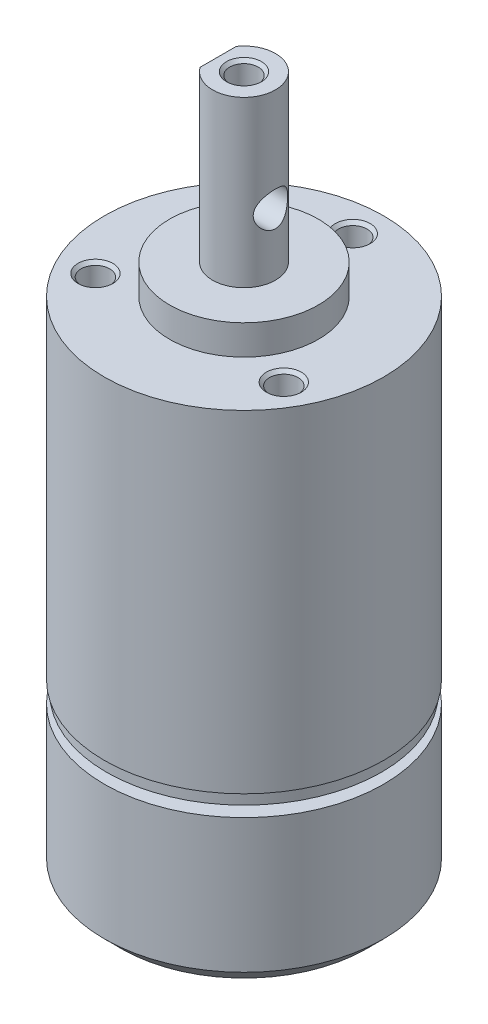
ISO-10303-21;
HEADER;
FILE_DESCRIPTION(('STEP AP214'),'2;1');
FILE_NAME('part.step','',(''),(''),'','','');
FILE_SCHEMA(('AUTOMOTIVE_DESIGN { 1 0 10303 214 1 1 1 1 }'));
ENDSEC;
DATA;
#1=APPLICATION_CONTEXT('core data for automotive mechanical design processes');
#2=APPLICATION_PROTOCOL_DEFINITION('international standard','automotive_design',2000,#1);
#3=PRODUCT_CONTEXT('',#1,'mechanical');
#4=PRODUCT('Part','Part','',(#3));
#5=PRODUCT_RELATED_PRODUCT_CATEGORY('part','',(#4));
#6=PRODUCT_DEFINITION_FORMATION('','',#4);
#7=PRODUCT_DEFINITION_CONTEXT('part definition',#1,'design');
#8=PRODUCT_DEFINITION('design','',#6,#7);
#9=PRODUCT_DEFINITION_SHAPE('','',#8);
#10=(LENGTH_UNIT() NAMED_UNIT(*) SI_UNIT(.MILLI.,.METRE.));
#11=(NAMED_UNIT(*) PLANE_ANGLE_UNIT() SI_UNIT($,.RADIAN.));
#12=(NAMED_UNIT(*) SI_UNIT($,.STERADIAN.) SOLID_ANGLE_UNIT());
#13=UNCERTAINTY_MEASURE_WITH_UNIT(LENGTH_MEASURE(1.E-05),#10,'distance_accuracy_value','');
#14=(GEOMETRIC_REPRESENTATION_CONTEXT(3) GLOBAL_UNCERTAINTY_ASSIGNED_CONTEXT((#13)) GLOBAL_UNIT_ASSIGNED_CONTEXT((#10,
#11,#12)) REPRESENTATION_CONTEXT('',''));
#15=CARTESIAN_POINT('',(0.,0.,0.));
#16=DIRECTION('',(0.,0.,1.));
#17=DIRECTION('',(1.,0.,0.));
#18=AXIS2_PLACEMENT_3D('',#15,#16,#17);
#19=CARTESIAN_POINT('',(0.,32.6,0.));
#20=DIRECTION('',(0.,1.,0.));
#21=DIRECTION('',(-1.,0.,0.));
#22=AXIS2_PLACEMENT_3D('',#19,#20,#21);
#23=CYLINDRICAL_SURFACE('',#22,2.99999999999999);
#24=CARTESIAN_POINT('',(0.,0.,0.));
#25=DIRECTION('',(0.,1.,0.));
#26=DIRECTION('',(-1.,0.,0.));
#27=AXIS2_PLACEMENT_3D('',#24,#25,#26);
#28=CIRCLE('',#27,3.);
#29=CARTESIAN_POINT('',(-3.,0.,0.));
#30=VERTEX_POINT('',#29);
#31=EDGE_CURVE('E269',#30,#30,#28,.T.);
#32=ORIENTED_EDGE('',*,*,#31,.F.);
#33=EDGE_LOOP('',(#32));
#34=FACE_BOUND('',#33,.T.);
#35=CARTESIAN_POINT('',(0.,-0.800000000000002,0.));
#36=DIRECTION('',(0.,1.,0.));
#37=DIRECTION('',(-1.,0.,0.));
#38=AXIS2_PLACEMENT_3D('',#35,#36,#37);
#39=CIRCLE('',#38,2.99999999999999);
#40=CARTESIAN_POINT('',(-2.99999999999998,-0.800000000000002,0.));
#41=VERTEX_POINT('',#40);
#42=EDGE_CURVE('E296',#41,#41,#39,.T.);
#43=ORIENTED_EDGE('',*,*,#42,.T.);
#44=EDGE_LOOP('',(#43));
#45=FACE_BOUND('',#44,.T.);
#46=ADVANCED_FACE('F40',(#34,#45),#23,.T.);
#47=CARTESIAN_POINT('',(3.,0.,0.));
#48=DIRECTION('',(0.,1.,0.));
#49=DIRECTION('',(-1.,0.,0.));
#50=AXIS2_PLACEMENT_3D('',#47,#48,#49);
#51=PLANE('',#50);
#52=CARTESIAN_POINT('',(0.,0.,0.));
#53=DIRECTION('',(0.,1.,0.));
#54=DIRECTION('',(-1.,0.,0.));
#55=AXIS2_PLACEMENT_3D('',#52,#53,#54);
#56=CIRCLE('',#55,12.);
#57=CARTESIAN_POINT('',(-12.,0.,0.));
#58=VERTEX_POINT('',#57);
#59=EDGE_CURVE('E275',#58,#58,#56,.T.);
#60=ORIENTED_EDGE('',*,*,#59,.F.);
#61=EDGE_LOOP('',(#60));
#62=FACE_BOUND('',#61,.T.);
#63=ORIENTED_EDGE('',*,*,#31,.T.);
#64=EDGE_LOOP('',(#63));
#65=FACE_BOUND('',#64,.T.);
#66=ADVANCED_FACE('F194',(#62,#65),#51,.F.);
#67=CARTESIAN_POINT('',(0.,32.6,0.));
#68=DIRECTION('',(0.,1.,0.));
#69=DIRECTION('',(-1.,0.,0.));
#70=AXIS2_PLACEMENT_3D('',#67,#68,#69);
#71=CYLINDRICAL_SURFACE('',#70,12.);
#72=CARTESIAN_POINT('',(0.,1.,0.));
#73=DIRECTION('',(0.,1.,0.));
#74=DIRECTION('',(-1.,0.,0.));
#75=AXIS2_PLACEMENT_3D('',#72,#73,#74);
#76=CIRCLE('',#75,12.);
#77=CARTESIAN_POINT('',(-12.,1.,0.));
#78=VERTEX_POINT('',#77);
#79=EDGE_CURVE('E313',#78,#78,#76,.T.);
#80=ORIENTED_EDGE('',*,*,#79,.F.);
#81=EDGE_LOOP('',(#80));
#82=FACE_BOUND('',#81,.T.);
#83=ORIENTED_EDGE('',*,*,#59,.T.);
#84=EDGE_LOOP('',(#83));
#85=FACE_BOUND('',#84,.T.);
#86=ADVANCED_FACE('F199',(#82,#85),#71,.T.);
#87=CARTESIAN_POINT('',(12.,1.,0.));
#88=DIRECTION('',(0.,1.,0.));
#89=DIRECTION('',(-1.,0.,0.));
#90=AXIS2_PLACEMENT_3D('',#87,#88,#89);
#91=PLANE('',#90);
#92=CARTESIAN_POINT('',(0.,1.,0.));
#93=DIRECTION('',(0.,1.,0.));
#94=DIRECTION('',(-1.,0.,0.));
#95=AXIS2_PLACEMENT_3D('',#92,#93,#94);
#96=CIRCLE('',#95,12.2);
#97=CARTESIAN_POINT('',(-12.2,1.,0.));
#98=VERTEX_POINT('',#97);
#99=EDGE_CURVE('E310',#98,#98,#96,.T.);
#100=ORIENTED_EDGE('',*,*,#99,.F.);
#101=EDGE_LOOP('',(#100));
#102=FACE_BOUND('',#101,.T.);
#103=ORIENTED_EDGE('',*,*,#79,.T.);
#104=EDGE_LOOP('',(#103));
#105=FACE_BOUND('',#104,.T.);
#106=ADVANCED_FACE('F207',(#102,#105),#91,.F.);
#107=CARTESIAN_POINT('',(0.,32.6,0.));
#108=DIRECTION('',(0.,1.,0.));
#109=DIRECTION('',(-1.,0.,0.));
#110=AXIS2_PLACEMENT_3D('',#107,#108,#109);
#111=CYLINDRICAL_SURFACE('',#110,12.2);
#112=CARTESIAN_POINT('',(0.,30.,0.));
#113=DIRECTION('',(0.,1.,0.));
#114=DIRECTION('',(-1.,0.,0.));
#115=AXIS2_PLACEMENT_3D('',#112,#113,#114);
#116=CIRCLE('',#115,12.2);
#117=CARTESIAN_POINT('',(-12.2,30.,0.));
#118=VERTEX_POINT('',#117);
#119=EDGE_CURVE('E307',#118,#118,#116,.T.);
#120=ORIENTED_EDGE('',*,*,#119,.F.);
#121=EDGE_LOOP('',(#120));
#122=FACE_BOUND('',#121,.T.);
#123=ORIENTED_EDGE('',*,*,#99,.T.);
#124=EDGE_LOOP('',(#123));
#125=FACE_BOUND('',#124,.T.);
#126=ADVANCED_FACE('F211',(#122,#125),#111,.T.);
#127=CARTESIAN_POINT('',(12.2,30.,0.));
#128=DIRECTION('',(0.,-1.,0.));
#129=DIRECTION('',(1.,0.,0.));
#130=AXIS2_PLACEMENT_3D('',#127,#128,#129);
#131=PLANE('',#130);
#132=CARTESIAN_POINT('',(8.22724133595214,30.,4.75000000000004));
#133=DIRECTION('',(0.,1.,0.));
#134=DIRECTION('',(0.,0.,1.));
#135=AXIS2_PLACEMENT_3D('',#132,#133,#134);
#136=CIRCLE('',#135,1.525);
#137=CARTESIAN_POINT('',(8.22724133595214,30.,6.27500000000004));
#138=VERTEX_POINT('',#137);
#139=EDGE_CURVE('E95',#138,#138,#136,.T.);
#140=ORIENTED_EDGE('',*,*,#139,.F.);
#141=EDGE_LOOP('',(#140));
#142=FACE_BOUND('',#141,.T.);
#143=CARTESIAN_POINT('',(-8.22724133595215,30.,4.75000000000004));
#144=DIRECTION('',(0.,1.,0.));
#145=DIRECTION('',(0.,0.,1.));
#146=AXIS2_PLACEMENT_3D('',#143,#144,#145);
#147=CIRCLE('',#146,1.525);
#148=CARTESIAN_POINT('',(-8.22724133595215,30.,6.27500000000004));
#149=VERTEX_POINT('',#148);
#150=EDGE_CURVE('E88',#149,#149,#147,.T.);
#151=ORIENTED_EDGE('',*,*,#150,.F.);
#152=EDGE_LOOP('',(#151));
#153=FACE_BOUND('',#152,.T.);
#154=CARTESIAN_POINT('',(0.,30.,-9.5));
#155=DIRECTION('',(0.,1.,0.));
#156=DIRECTION('',(0.,0.,1.));
#157=AXIS2_PLACEMENT_3D('',#154,#155,#156);
#158=CIRCLE('',#157,1.525);
#159=CARTESIAN_POINT('',(0.,30.,-7.975));
#160=VERTEX_POINT('',#159);
#161=EDGE_CURVE('E104',#160,#160,#158,.T.);
#162=ORIENTED_EDGE('',*,*,#161,.F.);
#163=EDGE_LOOP('',(#162));
#164=FACE_BOUND('',#163,.T.);
#165=CARTESIAN_POINT('',(0.,30.,0.));
#166=DIRECTION('',(0.,1.,0.));
#167=DIRECTION('',(-1.,0.,0.));
#168=AXIS2_PLACEMENT_3D('',#165,#166,#167);
#169=CIRCLE('',#168,6.5);
#170=CARTESIAN_POINT('',(-6.5,30.,0.));
#171=VERTEX_POINT('',#170);
#172=EDGE_CURVE('E299',#171,#171,#169,.T.);
#173=ORIENTED_EDGE('',*,*,#172,.F.);
#174=EDGE_LOOP('',(#173));
#175=FACE_BOUND('',#174,.T.);
#176=ORIENTED_EDGE('',*,*,#119,.T.);
#177=EDGE_LOOP('',(#176));
#178=FACE_BOUND('',#177,.T.);
#179=ADVANCED_FACE('F215',(#142,#153,#164,#175,#178),#131,.F.);
#180=CARTESIAN_POINT('',(0.,32.6,0.));
#181=DIRECTION('',(0.,1.,0.));
#182=DIRECTION('',(-1.,0.,0.));
#183=AXIS2_PLACEMENT_3D('',#180,#181,#182);
#184=CYLINDRICAL_SURFACE('',#183,6.5);
#185=CARTESIAN_POINT('',(0.,32.6,0.));
#186=DIRECTION('',(0.,1.,0.));
#187=DIRECTION('',(-1.,0.,0.));
#188=AXIS2_PLACEMENT_3D('',#185,#186,#187);
#189=CIRCLE('',#188,6.5);
#190=CARTESIAN_POINT('',(-6.5,32.6,0.));
#191=VERTEX_POINT('',#190);
#192=EDGE_CURVE('E295',#191,#191,#189,.T.);
#193=ORIENTED_EDGE('',*,*,#192,.F.);
#194=EDGE_LOOP('',(#193));
#195=FACE_BOUND('',#194,.T.);
#196=ORIENTED_EDGE('',*,*,#172,.T.);
#197=EDGE_LOOP('',(#196));
#198=FACE_BOUND('',#197,.T.);
#199=ADVANCED_FACE('F219',(#195,#198),#184,.T.);
#200=CARTESIAN_POINT('',(6.5,32.6,0.));
#201=DIRECTION('',(0.,-1.,0.));
#202=DIRECTION('',(1.,0.,0.));
#203=AXIS2_PLACEMENT_3D('',#200,#201,#202);
#204=PLANE('',#203);
#205=CARTESIAN_POINT('',(0.,32.6,0.));
#206=DIRECTION('',(0.,-1.,0.));
#207=DIRECTION('',(1.,0.,0.));
#208=AXIS2_PLACEMENT_3D('',#205,#206,#207);
#209=CIRCLE('',#208,2.75);
#210=CARTESIAN_POINT('',(2.75,32.6,0.));
#211=VERTEX_POINT('',#210);
#212=EDGE_CURVE('E268',#211,#211,#209,.F.);
#213=ORIENTED_EDGE('',*,*,#212,.F.);
#214=EDGE_LOOP('',(#213));
#215=FACE_BOUND('',#214,.T.);
#216=ORIENTED_EDGE('',*,*,#192,.T.);
#217=EDGE_LOOP('',(#216));
#218=FACE_BOUND('',#217,.T.);
#219=ADVANCED_FACE('F223',(#215,#218),#204,.F.);
#220=CARTESIAN_POINT('',(12.2,-14.,0.));
#221=DIRECTION('',(0.,1.,0.));
#222=DIRECTION('',(-1.,0.,0.));
#223=AXIS2_PLACEMENT_3D('',#220,#221,#222);
#224=PLANE('',#223);
#225=CARTESIAN_POINT('',(0.,-14.,0.));
#226=DIRECTION('',(0.,1.,0.));
#227=DIRECTION('',(-1.,0.,0.));
#228=AXIS2_PLACEMENT_3D('',#225,#226,#227);
#229=CIRCLE('',#228,3.);
#230=CARTESIAN_POINT('',(-3.,-14.,0.));
#231=VERTEX_POINT('',#230);
#232=EDGE_CURVE('E11',#231,#231,#229,.F.);
#233=ORIENTED_EDGE('',*,*,#232,.F.);
#234=EDGE_LOOP('',(#233));
#235=FACE_BOUND('',#234,.T.);
#236=CARTESIAN_POINT('',(0.,-14.,0.));
#237=DIRECTION('',(0.,1.,0.));
#238=DIRECTION('',(-1.,0.,0.));
#239=AXIS2_PLACEMENT_3D('',#236,#237,#238);
#240=CIRCLE('',#239,10.7);
#241=CARTESIAN_POINT('',(-10.7,-14.,0.));
#242=VERTEX_POINT('',#241);
#243=EDGE_CURVE('E48',#242,#242,#240,.F.);
#244=ORIENTED_EDGE('',*,*,#243,.T.);
#245=EDGE_LOOP('',(#244));
#246=FACE_BOUND('',#245,.T.);
#247=ADVANCED_FACE('F227',(#235,#246),#224,.F.);
#248=CARTESIAN_POINT('',(0.,32.6,0.));
#249=DIRECTION('',(0.,1.,0.));
#250=DIRECTION('',(-1.,0.,0.));
#251=AXIS2_PLACEMENT_3D('',#248,#249,#250);
#252=CYLINDRICAL_SURFACE('',#251,12.2);
#253=CARTESIAN_POINT('',(0.,-12.5,0.));
#254=DIRECTION('',(0.,1.,0.));
#255=DIRECTION('',(-1.,0.,0.));
#256=AXIS2_PLACEMENT_3D('',#253,#254,#255);
#257=CIRCLE('',#256,12.2);
#258=CARTESIAN_POINT('',(-12.2,-12.5,0.));
#259=VERTEX_POINT('',#258);
#260=EDGE_CURVE('E281',#259,#259,#257,.T.);
#261=ORIENTED_EDGE('',*,*,#260,.T.);
#262=EDGE_LOOP('',(#261));
#263=FACE_BOUND('',#262,.T.);
#264=CARTESIAN_POINT('',(0.,-0.800000000000002,0.));
#265=DIRECTION('',(0.,1.,0.));
#266=DIRECTION('',(-1.,0.,0.));
#267=AXIS2_PLACEMENT_3D('',#264,#265,#266);
#268=CIRCLE('',#267,12.2);
#269=CARTESIAN_POINT('',(-12.2,-0.800000000000003,0.));
#270=VERTEX_POINT('',#269);
#271=EDGE_CURVE('E293',#270,#270,#268,.T.);
#272=ORIENTED_EDGE('',*,*,#271,.F.);
#273=EDGE_LOOP('',(#272));
#274=FACE_BOUND('',#273,.T.);
#275=ADVANCED_FACE('F231',(#263,#274),#252,.T.);
#276=CARTESIAN_POINT('',(2.99999999999999,-0.8,0.));
#277=DIRECTION('',(0.,-1.,0.));
#278=DIRECTION('',(1.,0.,0.));
#279=AXIS2_PLACEMENT_3D('',#276,#277,#278);
#280=PLANE('',#279);
#281=ORIENTED_EDGE('',*,*,#42,.F.);
#282=EDGE_LOOP('',(#281));
#283=FACE_BOUND('',#282,.T.);
#284=ORIENTED_EDGE('',*,*,#271,.T.);
#285=EDGE_LOOP('',(#284));
#286=FACE_BOUND('',#285,.T.);
#287=ADVANCED_FACE('F235',(#283,#286),#280,.F.);
#288=CARTESIAN_POINT('',(0.,47.,0.));
#289=DIRECTION('',(0.,-1.,0.));
#290=DIRECTION('',(1.,0.,0.));
#291=AXIS2_PLACEMENT_3D('',#288,#289,#290);
#292=CYLINDRICAL_SURFACE('',#291,2.75);
#293=CARTESIAN_POINT('',(2.75,36.5,0.));
#294=CARTESIAN_POINT('',(2.7499955328939,36.5000049631793,-0.0779729491591987));
#295=CARTESIAN_POINT('',(2.74664984832555,36.5061149657252,-0.156011763199369));
#296=CARTESIAN_POINT('',(2.73359531725477,36.5302576858122,-0.309727419942126));
#297=CARTESIAN_POINT('',(2.72387746390221,36.5483072798899,-0.385400760270942));
#298=CARTESIAN_POINT('',(2.69908175997792,36.5953862307853,-0.531939595227226));
#299=CARTESIAN_POINT('',(2.68402590603009,36.6243705591243,-0.60282342003249));
#300=CARTESIAN_POINT('',(2.64988699120143,36.6922310740886,-0.738583753627355));
#301=CARTESIAN_POINT('',(2.63080379903717,36.7311075831884,-0.803460066484467));
#302=CARTESIAN_POINT('',(2.58877435218394,36.8206271064429,-0.93032862682229));
#303=CARTESIAN_POINT('',(2.56565357097933,36.8718908816666,-0.991824039823096));
#304=CARTESIAN_POINT('',(2.51862762447079,36.9833678113197,-1.10581385535795));
#305=CARTESIAN_POINT('',(2.49472176235856,37.043589093065,-1.15829998946552));
#306=CARTESIAN_POINT('',(2.44613124305119,37.1781922012057,-1.25789480508437));
#307=CARTESIAN_POINT('',(2.42159402839635,37.2533797105644,-1.30399588373322));
#308=CARTESIAN_POINT('',(2.37752741687072,37.4118668701284,-1.38271834252752));
#309=CARTESIAN_POINT('',(2.35799408630603,37.4951600766918,-1.41535032352208));
#310=CARTESIAN_POINT('',(2.32814537755157,37.6622638246073,-1.46390282772391));
#311=CARTESIAN_POINT('',(2.31732653409192,37.7457107558487,-1.48074714512668));
#312=CARTESIAN_POINT('',(2.30492353478053,37.9148841640737,-1.49999173211584));
#313=CARTESIAN_POINT('',(2.30332659165822,38.0006073189115,-1.50241200252224));
#314=CARTESIAN_POINT('',(2.30916059512703,38.1580937298528,-1.49341328400853));
#315=CARTESIAN_POINT('',(2.31528177670115,38.2300337855055,-1.48400270922342));
#316=CARTESIAN_POINT('',(2.33351887542567,38.3710880787635,-1.45515575974201));
#317=CARTESIAN_POINT('',(2.34563743072956,38.440201058283,-1.43571497274773));
#318=CARTESIAN_POINT('',(2.37471884026675,38.5755577386877,-1.38709156246769));
#319=CARTESIAN_POINT('',(2.39178172165247,38.6417057976598,-1.35770543388282));
#320=CARTESIAN_POINT('',(2.42886159364227,38.7684721974986,-1.29019902560379));
#321=CARTESIAN_POINT('',(2.44887986910387,38.8290881146256,-1.25207494308155));
#322=CARTESIAN_POINT('',(2.49334307244702,38.9529437798222,-1.16132176252092));
#323=CARTESIAN_POINT('',(2.51799359501409,39.0151375894829,-1.10736092970256));
#324=CARTESIAN_POINT('',(2.56648691782871,39.1300761712186,-0.989793791710639));
#325=CARTESIAN_POINT('',(2.59032917374526,39.1828146742053,-0.926181138373376));
#326=CARTESIAN_POINT('',(2.63638937585234,39.2806370372531,-0.785961873234598));
#327=CARTESIAN_POINT('',(2.65840123043427,39.3250012075057,-0.708779639865439));
#328=CARTESIAN_POINT('',(2.69642211220391,39.3997250213693,-0.546555778353404));
#329=CARTESIAN_POINT('',(2.71243670343128,39.4300976518663,-0.461521526804289));
#330=CARTESIAN_POINT('',(2.73537507908383,39.4731172515579,-0.294396859582252));
#331=CARTESIAN_POINT('',(2.74300133491569,39.4871411961511,-0.212758791189682));
#332=CARTESIAN_POINT('',(2.75081609737274,39.5015089965017,-0.0479518531447231));
#333=CARTESIAN_POINT('',(2.75100922913374,39.501861359171,0.0352160323678894));
#334=CARTESIAN_POINT('',(2.74429233918013,39.489516380519,0.192203941982917));
#335=CARTESIAN_POINT('',(2.7380609521636,39.4780658293528,0.266156276118836));
#336=CARTESIAN_POINT('',(2.72010654770259,39.4445344608542,0.410901730265211));
#337=CARTESIAN_POINT('',(2.70838297051789,39.4224525600144,0.481694527463726));
#338=CARTESIAN_POINT('',(2.68013382891396,39.3679082647443,0.620072033300047));
#339=CARTESIAN_POINT('',(2.66350324409949,39.3352170943584,0.687544326035437));
#340=CARTESIAN_POINT('',(2.62692883380051,39.2606780441278,0.816227077628909));
#341=CARTESIAN_POINT('',(2.60698377449004,39.2188267525459,0.877435190860023));
#342=CARTESIAN_POINT('',(2.56300184221368,39.1218510064577,0.999076047764808));
#343=CARTESIAN_POINT('',(2.5387564598654,39.0657696147143,1.05867122088779));
#344=CARTESIAN_POINT('',(2.49032836693211,38.9446269088834,1.16805413999383));
#345=CARTESIAN_POINT('',(2.46614574384712,38.879556624513,1.21783196696366));
#346=CARTESIAN_POINT('',(2.41863034974007,38.7363210582538,1.30981050679895));
#347=CARTESIAN_POINT('',(2.3954964937728,38.6575403087745,1.35116579672796));
#348=CARTESIAN_POINT('',(2.35557673325721,38.4925453122988,1.41962887927166));
#349=CARTESIAN_POINT('',(2.33878162902652,38.4063420629366,1.44675734230938));
#350=CARTESIAN_POINT('',(2.31576769108302,38.2377890121751,1.48328938456405));
#351=CARTESIAN_POINT('',(2.30867825825265,38.1558813229417,1.49416166817435));
#352=CARTESIAN_POINT('',(2.30343772372916,37.9911352324001,1.50223385888718));
#353=CARTESIAN_POINT('',(2.30527941768141,37.9082976350114,1.49944478599832));
#354=CARTESIAN_POINT('',(2.31670968294054,37.7557132884905,1.48170001222614));
#355=CARTESIAN_POINT('',(2.32524317806448,37.6856823349733,1.46839952788391));
#356=CARTESIAN_POINT('',(2.34762721988833,37.5489956674916,1.4323386957082));
#357=CARTESIAN_POINT('',(2.36147988599044,37.4823413109167,1.40957457682849));
#358=CARTESIAN_POINT('',(2.3939664108627,37.3496322441533,1.35370854482785));
#359=CARTESIAN_POINT('',(2.41284421791643,37.2838731488007,1.32005131888591));
#360=CARTESIAN_POINT('',(2.45297719359377,37.1584946690174,1.24388744619949));
#361=CARTESIAN_POINT('',(2.47423362899282,37.0988785889187,1.20137607356301));
#362=CARTESIAN_POINT('',(2.52062694545993,36.9779218747471,1.1011070383827));
#363=CARTESIAN_POINT('',(2.54585863647191,36.9177211418191,1.0420107430402));
#364=CARTESIAN_POINT('',(2.59453539642988,36.8077127912067,0.914094879509432));
#365=CARTESIAN_POINT('',(2.61797921165257,36.7579124248578,0.845268583073133));
#366=CARTESIAN_POINT('',(2.66139613447404,36.6688006567857,0.696873306455468));
#367=CARTESIAN_POINT('',(2.68123529430281,36.6298728117991,0.61703247318212));
#368=CARTESIAN_POINT('',(2.7141487793251,36.5665278475479,0.450596179441354));
#369=CARTESIAN_POINT('',(2.72724064660339,36.5420730753369,0.364018915057525));
#370=CARTESIAN_POINT('',(2.74071669432246,36.5170735250008,0.230355165227766));
#371=CARTESIAN_POINT('',(2.74418450271713,36.5106844483475,0.184596650535415));
#372=CARTESIAN_POINT('',(2.74882747533462,36.5021462241935,0.0925664947855433));
#373=CARTESIAN_POINT('',(2.75000265225361,36.499997053213,0.0462948565710336));
#374=CARTESIAN_POINT('',(2.75,36.5,0.));
#375=B_SPLINE_CURVE_WITH_KNOTS('',3,(#293,#294,#295,#296,#297,#298,#299,#300,#301,#302,#303,
#304,#305,#306,#307,#308,#309,#310,#311,#312,#313,#314,#315,#316,#317,#318,#319,#320,#321,#322,
#323,#324,#325,#326,#327,#328,#329,#330,#331,#332,#333,#334,#335,#336,#337,#338,#339,#340,#341,
#342,#343,#344,#345,#346,#347,#348,#349,#350,#351,#352,#353,#354,#355,#356,#357,#358,#359,#360,
#361,#362,#363,#364,#365,#366,#367,#368,#369,#370,#371,#372,#373,#374),.UNSPECIFIED.,.T.,.F.,(4,
2,2,2,2,2,2,2,2,2,2,2,2,2,2,2,2,2,2,2,2,2,2,2,2,2,2,2,2,2,2,2,2,2,2,2,2,2,2,2,4),(0.,
0.233732365670662,0.467795818544868,0.700905752709467,0.934023286981208,1.18300734378139,
1.43221870235057,1.70547758592502,1.97852098918854,2.23435206692626,2.48982831886023,
2.70723672174195,2.92474084439228,3.14699566236443,3.36934739171625,3.62611318738823,
3.88304860020488,4.15667273405989,4.43004237689776,4.6781878937731,4.92617900379767,
5.15041519453526,5.37467424342679,5.60413212023295,5.83367560575034,6.08865618522294,
6.34389308070037,6.61822417400225,6.89215557446505,7.13941350036001,7.38647200714689,
7.60090682707191,7.81542717649291,8.04330134656289,8.27129745737792,8.53429002491757,
8.79746534824315,9.06900285379736,9.33983078990055,9.47860540833467,9.61737925825842),.UNSPECIFIED.);
#376=CARTESIAN_POINT('',(2.75,36.5,0.));
#377=VERTEX_POINT('',#376);
#378=EDGE_CURVE('E127',#377,#377,#375,.T.);
#379=ORIENTED_EDGE('',*,*,#378,.F.);
#380=EDGE_LOOP('',(#379));
#381=FACE_BOUND('',#380,.T.);
#382=CARTESIAN_POINT('',(0.,47.,0.));
#383=DIRECTION('',(0.,1.,0.));
#384=DIRECTION('',(-1.,0.,0.));
#385=AXIS2_PLACEMENT_3D('',#382,#383,#384);
#386=CIRCLE('',#385,2.75);
#387=CARTESIAN_POINT('',(-2.25,47.,1.58113883008419));
#388=VERTEX_POINT('',#387);
#389=CARTESIAN_POINT('',(-2.25,47.,-1.58113883008419));
#390=VERTEX_POINT('',#389);
#391=EDGE_CURVE('E265',#388,#390,#386,.T.);
#392=ORIENTED_EDGE('',*,*,#391,.F.);
#393=DIRECTION('',(0.,-1.,0.));
#394=VECTOR('',#393,1.);
#395=CARTESIAN_POINT('',(-2.25,47.,1.58113883008419));
#396=LINE('',#395,#394);
#397=CARTESIAN_POINT('',(-2.25,35.5,1.58113883008419));
#398=VERTEX_POINT('',#397);
#399=EDGE_CURVE('E55',#388,#398,#396,.T.);
#400=ORIENTED_EDGE('',*,*,#399,.T.);
#401=CARTESIAN_POINT('',(0.,35.5,0.));
#402=DIRECTION('',(0.,-1.,0.));
#403=DIRECTION('',(0.,0.,-1.));
#404=AXIS2_PLACEMENT_3D('',#401,#402,#403);
#405=CIRCLE('',#404,2.75);
#406=CARTESIAN_POINT('',(-2.25,35.5,-1.58113883008419));
#407=VERTEX_POINT('',#406);
#408=EDGE_CURVE('E272',#398,#407,#405,.T.);
#409=ORIENTED_EDGE('',*,*,#408,.T.);
#410=DIRECTION('',(0.,-1.,0.));
#411=VECTOR('',#410,1.);
#412=CARTESIAN_POINT('',(-2.25,47.,-1.58113883008419));
#413=LINE('',#412,#411);
#414=EDGE_CURVE('E330',#407,#390,#413,.F.);
#415=ORIENTED_EDGE('',*,*,#414,.T.);
#416=EDGE_LOOP('',(#392,#400,#409,#415));
#417=FACE_BOUND('',#416,.T.);
#418=ORIENTED_EDGE('',*,*,#212,.T.);
#419=EDGE_LOOP('',(#418));
#420=FACE_BOUND('',#419,.T.);
#421=ADVANCED_FACE('F239',(#381,#417,#420),#292,.T.);
#422=CARTESIAN_POINT('',(0.,47.,0.));
#423=DIRECTION('',(0.,1.,0.));
#424=DIRECTION('',(-1.,0.,0.));
#425=AXIS2_PLACEMENT_3D('',#422,#423,#424);
#426=PLANE('',#425);
#427=CARTESIAN_POINT('',(0.,47.,0.));
#428=DIRECTION('',(0.,1.,0.));
#429=DIRECTION('',(0.,0.,1.));
#430=AXIS2_PLACEMENT_3D('',#427,#428,#429);
#431=CIRCLE('',#430,1.525);
#432=CARTESIAN_POINT('',(0.,47.,1.525));
#433=VERTEX_POINT('',#432);
#434=EDGE_CURVE('E113',#433,#433,#431,.T.);
#435=ORIENTED_EDGE('',*,*,#434,.F.);
#436=EDGE_LOOP('',(#435));
#437=FACE_BOUND('',#436,.T.);
#438=DIRECTION('',(0.,0.,-1.));
#439=VECTOR('',#438,1.);
#440=CARTESIAN_POINT('',(-2.25,47.,0.));
#441=LINE('',#440,#439);
#442=EDGE_CURVE('E59',#388,#390,#441,.T.);
#443=ORIENTED_EDGE('',*,*,#442,.F.);
#444=ORIENTED_EDGE('',*,*,#391,.T.);
#445=EDGE_LOOP('',(#443,#444));
#446=FACE_BOUND('',#445,.T.);
#447=ADVANCED_FACE('F243',(#437,#446),#426,.T.);
#448=CARTESIAN_POINT('',(-3.75,35.5,-12.2));
#449=DIRECTION('',(0.,-1.,0.));
#450=DIRECTION('',(0.,0.,-1.));
#451=AXIS2_PLACEMENT_3D('',#448,#449,#450);
#452=PLANE('',#451);
#453=DIRECTION('',(0.,0.,1.));
#454=VECTOR('',#453,1.);
#455=CARTESIAN_POINT('',(-2.25,35.5,-12.2));
#456=LINE('',#455,#454);
#457=EDGE_CURVE('E135',#407,#398,#456,.T.);
#458=ORIENTED_EDGE('',*,*,#457,.F.);
#459=ORIENTED_EDGE('',*,*,#408,.F.);
#460=EDGE_LOOP('',(#458,#459));
#461=FACE_BOUND('',#460,.T.);
#462=ADVANCED_FACE('F247',(#461),#452,.F.);
#463=CARTESIAN_POINT('',(-2.25,47.5,-12.2));
#464=DIRECTION('',(1.,0.,0.));
#465=DIRECTION('',(0.,1.,0.));
#466=AXIS2_PLACEMENT_3D('',#463,#464,#465);
#467=PLANE('',#466);
#468=CARTESIAN_POINT('',(-2.25,38.,0.));
#469=DIRECTION('',(-1.,0.,0.));
#470=DIRECTION('',(0.,-1.,0.));
#471=AXIS2_PLACEMENT_3D('',#468,#469,#470);
#472=CIRCLE('',#471,1.5);
#473=CARTESIAN_POINT('',(-2.25,36.5,0.));
#474=VERTEX_POINT('',#473);
#475=EDGE_CURVE('E124',#474,#474,#472,.T.);
#476=ORIENTED_EDGE('',*,*,#475,.F.);
#477=EDGE_LOOP('',(#476));
#478=FACE_BOUND('',#477,.T.);
#479=ORIENTED_EDGE('',*,*,#442,.T.);
#480=ORIENTED_EDGE('',*,*,#414,.F.);
#481=ORIENTED_EDGE('',*,*,#457,.T.);
#482=ORIENTED_EDGE('',*,*,#399,.F.);
#483=EDGE_LOOP('',(#479,#480,#481,#482));
#484=FACE_BOUND('',#483,.T.);
#485=ADVANCED_FACE('F250',(#478,#484),#467,.F.);
#486=CARTESIAN_POINT('',(12.201,38.,0.));
#487=DIRECTION('',(-1.,0.,0.));
#488=DIRECTION('',(0.,-1.,0.));
#489=AXIS2_PLACEMENT_3D('',#486,#487,#488);
#490=CYLINDRICAL_SURFACE('',#489,1.5);
#491=ORIENTED_EDGE('',*,*,#475,.T.);
#492=EDGE_LOOP('',(#491));
#493=FACE_BOUND('',#492,.T.);
#494=ORIENTED_EDGE('',*,*,#378,.T.);
#495=EDGE_LOOP('',(#494));
#496=FACE_BOUND('',#495,.T.);
#497=ADVANCED_FACE('F137',(#493,#496),#490,.F.);
#498=CARTESIAN_POINT('',(0.,41.5,0.));
#499=DIRECTION('',(0.,1.,0.));
#500=DIRECTION('',(0.,0.,1.));
#501=AXIS2_PLACEMENT_3D('',#498,#499,#500);
#502=CONICAL_SURFACE('',#501,1.25,1.02974425867665);
#503=CARTESIAN_POINT('',(0.,40.7489242262155,0.));
#504=VERTEX_POINT('',#503);
#505=VERTEX_LOOP('',#504);
#506=FACE_BOUND('',#505,.T.);
#507=CARTESIAN_POINT('',(0.,41.5,0.));
#508=DIRECTION('',(0.,1.,0.));
#509=DIRECTION('',(0.,0.,1.));
#510=AXIS2_PLACEMENT_3D('',#507,#508,#509);
#511=CIRCLE('',#510,1.25);
#512=CARTESIAN_POINT('',(0.,41.5,1.25));
#513=VERTEX_POINT('',#512);
#514=EDGE_CURVE('E121',#513,#513,#511,.T.);
#515=ORIENTED_EDGE('',*,*,#514,.T.);
#516=EDGE_LOOP('',(#515));
#517=FACE_BOUND('',#516,.T.);
#518=ADVANCED_FACE('F142',(#506,#517),#502,.F.);
#519=CARTESIAN_POINT('',(0.,47.,0.));
#520=DIRECTION('',(0.,1.,0.));
#521=DIRECTION('',(0.,0.,1.));
#522=AXIS2_PLACEMENT_3D('',#519,#520,#521);
#523=CYLINDRICAL_SURFACE('',#522,1.25);
#524=ORIENTED_EDGE('',*,*,#514,.F.);
#525=EDGE_LOOP('',(#524));
#526=FACE_BOUND('',#525,.T.);
#527=CARTESIAN_POINT('',(0.,46.725,0.));
#528=DIRECTION('',(0.,1.,0.));
#529=DIRECTION('',(0.,0.,1.));
#530=AXIS2_PLACEMENT_3D('',#527,#528,#529);
#531=CIRCLE('',#530,1.25);
#532=CARTESIAN_POINT('',(0.,46.725,1.25));
#533=VERTEX_POINT('',#532);
#534=EDGE_CURVE('E117',#533,#533,#531,.T.);
#535=ORIENTED_EDGE('',*,*,#534,.T.);
#536=EDGE_LOOP('',(#535));
#537=FACE_BOUND('',#536,.T.);
#538=ADVANCED_FACE('F145',(#526,#537),#523,.F.);
#539=CARTESIAN_POINT('',(0.,47.,0.));
#540=DIRECTION('',(0.,1.,0.));
#541=DIRECTION('',(0.,0.,1.));
#542=AXIS2_PLACEMENT_3D('',#539,#540,#541);
#543=CONICAL_SURFACE('',#542,1.525,0.785398163397454);
#544=ORIENTED_EDGE('',*,*,#534,.F.);
#545=EDGE_LOOP('',(#544));
#546=FACE_BOUND('',#545,.T.);
#547=ORIENTED_EDGE('',*,*,#434,.T.);
#548=EDGE_LOOP('',(#547));
#549=FACE_BOUND('',#548,.T.);
#550=ADVANCED_FACE('F149',(#546,#549),#543,.F.);
#551=CARTESIAN_POINT('',(0.,26.,-9.5));
#552=DIRECTION('',(0.,1.,0.));
#553=DIRECTION('',(0.,0.,1.));
#554=AXIS2_PLACEMENT_3D('',#551,#552,#553);
#555=CONICAL_SURFACE('',#554,1.25,1.02974425867665);
#556=CARTESIAN_POINT('',(0.,25.2489242262155,-9.5));
#557=VERTEX_POINT('',#556);
#558=VERTEX_LOOP('',#557);
#559=FACE_BOUND('',#558,.T.);
#560=CARTESIAN_POINT('',(0.,26.,-9.5));
#561=DIRECTION('',(0.,1.,0.));
#562=DIRECTION('',(0.,0.,1.));
#563=AXIS2_PLACEMENT_3D('',#560,#561,#562);
#564=CIRCLE('',#563,1.25);
#565=CARTESIAN_POINT('',(0.,26.,-8.25));
#566=VERTEX_POINT('',#565);
#567=EDGE_CURVE('E110',#566,#566,#564,.T.);
#568=ORIENTED_EDGE('',*,*,#567,.T.);
#569=EDGE_LOOP('',(#568));
#570=FACE_BOUND('',#569,.T.);
#571=ADVANCED_FACE('F153',(#559,#570),#555,.F.);
#572=CARTESIAN_POINT('',(0.,30.,-9.5));
#573=DIRECTION('',(0.,1.,0.));
#574=DIRECTION('',(0.,0.,1.));
#575=AXIS2_PLACEMENT_3D('',#572,#573,#574);
#576=CYLINDRICAL_SURFACE('',#575,1.24999999999999);
#577=ORIENTED_EDGE('',*,*,#567,.F.);
#578=EDGE_LOOP('',(#577));
#579=FACE_BOUND('',#578,.T.);
#580=CARTESIAN_POINT('',(0.,29.725,-9.5));
#581=DIRECTION('',(0.,1.,0.));
#582=DIRECTION('',(0.,0.,1.));
#583=AXIS2_PLACEMENT_3D('',#580,#581,#582);
#584=CIRCLE('',#583,1.24999999999999);
#585=CARTESIAN_POINT('',(0.,29.725,-8.25000000000001));
#586=VERTEX_POINT('',#585);
#587=EDGE_CURVE('E107',#586,#586,#584,.T.);
#588=ORIENTED_EDGE('',*,*,#587,.T.);
#589=EDGE_LOOP('',(#588));
#590=FACE_BOUND('',#589,.T.);
#591=ADVANCED_FACE('F157',(#579,#590),#576,.F.);
#592=CARTESIAN_POINT('',(0.,30.,-9.5));
#593=DIRECTION('',(0.,1.,0.));
#594=DIRECTION('',(0.,0.,1.));
#595=AXIS2_PLACEMENT_3D('',#592,#593,#594);
#596=CONICAL_SURFACE('',#595,1.525,0.785398163397467);
#597=ORIENTED_EDGE('',*,*,#587,.F.);
#598=EDGE_LOOP('',(#597));
#599=FACE_BOUND('',#598,.T.);
#600=ORIENTED_EDGE('',*,*,#161,.T.);
#601=EDGE_LOOP('',(#600));
#602=FACE_BOUND('',#601,.T.);
#603=ADVANCED_FACE('F161',(#599,#602),#596,.F.);
#604=CARTESIAN_POINT('',(-8.22724133595215,26.,4.75000000000004));
#605=DIRECTION('',(0.,1.,0.));
#606=DIRECTION('',(0.,0.,1.));
#607=AXIS2_PLACEMENT_3D('',#604,#605,#606);
#608=CONICAL_SURFACE('',#607,1.25,1.02974425867665);
#609=CARTESIAN_POINT('',(-8.22724133595215,25.2489242262155,4.75000000000004));
#610=VERTEX_POINT('',#609);
#611=VERTEX_LOOP('',#610);
#612=FACE_BOUND('',#611,.T.);
#613=CARTESIAN_POINT('',(-8.22724133595215,26.,4.75000000000004));
#614=DIRECTION('',(0.,1.,0.));
#615=DIRECTION('',(0.,0.,1.));
#616=AXIS2_PLACEMENT_3D('',#613,#614,#615);
#617=CIRCLE('',#616,1.25);
#618=CARTESIAN_POINT('',(-8.22724133595215,26.,6.00000000000004));
#619=VERTEX_POINT('',#618);
#620=EDGE_CURVE('E101',#619,#619,#617,.T.);
#621=ORIENTED_EDGE('',*,*,#620,.T.);
#622=EDGE_LOOP('',(#621));
#623=FACE_BOUND('',#622,.T.);
#624=ADVANCED_FACE('F165',(#612,#623),#608,.F.);
#625=CARTESIAN_POINT('',(-8.22724133595215,30.,4.75000000000004));
#626=DIRECTION('',(0.,1.,0.));
#627=DIRECTION('',(0.,0.,1.));
#628=AXIS2_PLACEMENT_3D('',#625,#626,#627);
#629=CYLINDRICAL_SURFACE('',#628,1.24999999999999);
#630=ORIENTED_EDGE('',*,*,#620,.F.);
#631=EDGE_LOOP('',(#630));
#632=FACE_BOUND('',#631,.T.);
#633=CARTESIAN_POINT('',(-8.22724133595215,29.725,4.75000000000004));
#634=DIRECTION('',(0.,1.,0.));
#635=DIRECTION('',(0.,0.,1.));
#636=AXIS2_PLACEMENT_3D('',#633,#634,#635);
#637=CIRCLE('',#636,1.24999999999999);
#638=CARTESIAN_POINT('',(-8.22724133595215,29.725,6.00000000000003));
#639=VERTEX_POINT('',#638);
#640=EDGE_CURVE('E92',#639,#639,#637,.T.);
#641=ORIENTED_EDGE('',*,*,#640,.T.);
#642=EDGE_LOOP('',(#641));
#643=FACE_BOUND('',#642,.T.);
#644=ADVANCED_FACE('F169',(#632,#643),#629,.F.);
#645=CARTESIAN_POINT('',(-8.22724133595215,30.,4.75000000000004));
#646=DIRECTION('',(0.,1.,0.));
#647=DIRECTION('',(0.,0.,1.));
#648=AXIS2_PLACEMENT_3D('',#645,#646,#647);
#649=CONICAL_SURFACE('',#648,1.525,0.785398163397467);
#650=ORIENTED_EDGE('',*,*,#640,.F.);
#651=EDGE_LOOP('',(#650));
#652=FACE_BOUND('',#651,.T.);
#653=ORIENTED_EDGE('',*,*,#150,.T.);
#654=EDGE_LOOP('',(#653));
#655=FACE_BOUND('',#654,.T.);
#656=ADVANCED_FACE('F82',(#652,#655),#649,.F.);
#657=CARTESIAN_POINT('',(8.22724133595214,26.,4.75000000000004));
#658=DIRECTION('',(0.,1.,0.));
#659=DIRECTION('',(0.,0.,1.));
#660=AXIS2_PLACEMENT_3D('',#657,#658,#659);
#661=CONICAL_SURFACE('',#660,1.25,1.02974425867665);
#662=CARTESIAN_POINT('',(8.22724133595214,25.2489242262155,4.75000000000004));
#663=VERTEX_POINT('',#662);
#664=VERTEX_LOOP('',#663);
#665=FACE_BOUND('',#664,.T.);
#666=CARTESIAN_POINT('',(8.22724133595214,26.,4.75000000000004));
#667=DIRECTION('',(0.,1.,0.));
#668=DIRECTION('',(0.,0.,1.));
#669=AXIS2_PLACEMENT_3D('',#666,#667,#668);
#670=CIRCLE('',#669,1.25);
#671=CARTESIAN_POINT('',(8.22724133595214,26.,6.00000000000004));
#672=VERTEX_POINT('',#671);
#673=EDGE_CURVE('E86',#672,#672,#670,.T.);
#674=ORIENTED_EDGE('',*,*,#673,.T.);
#675=EDGE_LOOP('',(#674));
#676=FACE_BOUND('',#675,.T.);
#677=ADVANCED_FACE('F78',(#665,#676),#661,.F.);
#678=CARTESIAN_POINT('',(8.22724133595214,30.,4.75000000000004));
#679=DIRECTION('',(0.,1.,0.));
#680=DIRECTION('',(0.,0.,1.));
#681=AXIS2_PLACEMENT_3D('',#678,#679,#680);
#682=CYLINDRICAL_SURFACE('',#681,1.24999999999999);
#683=ORIENTED_EDGE('',*,*,#673,.F.);
#684=EDGE_LOOP('',(#683));
#685=FACE_BOUND('',#684,.T.);
#686=CARTESIAN_POINT('',(8.22724133595214,29.725,4.75000000000004));
#687=DIRECTION('',(0.,1.,0.));
#688=DIRECTION('',(0.,0.,1.));
#689=AXIS2_PLACEMENT_3D('',#686,#687,#688);
#690=CIRCLE('',#689,1.24999999999999);
#691=CARTESIAN_POINT('',(8.22724133595214,29.725,6.00000000000003));
#692=VERTEX_POINT('',#691);
#693=EDGE_CURVE('E89',#692,#692,#690,.T.);
#694=ORIENTED_EDGE('',*,*,#693,.T.);
#695=EDGE_LOOP('',(#694));
#696=FACE_BOUND('',#695,.T.);
#697=ADVANCED_FACE('F81',(#685,#696),#682,.F.);
#698=CARTESIAN_POINT('',(8.22724133595214,30.,4.75000000000004));
#699=DIRECTION('',(0.,1.,0.));
#700=DIRECTION('',(0.,0.,1.));
#701=AXIS2_PLACEMENT_3D('',#698,#699,#700);
#702=CONICAL_SURFACE('',#701,1.525,0.785398163397467);
#703=ORIENTED_EDGE('',*,*,#693,.F.);
#704=EDGE_LOOP('',(#703));
#705=FACE_BOUND('',#704,.T.);
#706=ORIENTED_EDGE('',*,*,#139,.T.);
#707=EDGE_LOOP('',(#706));
#708=FACE_BOUND('',#707,.T.);
#709=ADVANCED_FACE('F179',(#705,#708),#702,.F.);
#710=CARTESIAN_POINT('',(0.,-12.5,0.));
#711=DIRECTION('',(0.,1.,0.));
#712=DIRECTION('',(-1.,0.,0.));
#713=AXIS2_PLACEMENT_3D('',#710,#711,#712);
#714=CONICAL_SURFACE('',#713,12.2,0.785398163397453);
#715=ORIENTED_EDGE('',*,*,#243,.F.);
#716=EDGE_LOOP('',(#715));
#717=FACE_BOUND('',#716,.T.);
#718=ORIENTED_EDGE('',*,*,#260,.F.);
#719=EDGE_LOOP('',(#718));
#720=FACE_BOUND('',#719,.T.);
#721=ADVANCED_FACE('F42',(#717,#720),#714,.T.);
#722=CARTESIAN_POINT('',(0.,-18.,0.));
#723=DIRECTION('',(0.,1.,0.));
#724=DIRECTION('',(-1.,0.,0.));
#725=AXIS2_PLACEMENT_3D('',#722,#723,#724);
#726=CYLINDRICAL_SURFACE('',#725,3.);
#727=CARTESIAN_POINT('',(0.,-18.,0.));
#728=DIRECTION('',(0.,-1.,0.));
#729=DIRECTION('',(1.,0.,0.));
#730=AXIS2_PLACEMENT_3D('',#727,#728,#729);
#731=CIRCLE('',#730,3.);
#732=CARTESIAN_POINT('',(3.,-18.,0.));
#733=VERTEX_POINT('',#732);
#734=EDGE_CURVE('E545',#733,#733,#731,.T.);
#735=ORIENTED_EDGE('',*,*,#734,.F.);
#736=EDGE_LOOP('',(#735));
#737=FACE_BOUND('',#736,.T.);
#738=ORIENTED_EDGE('',*,*,#232,.T.);
#739=EDGE_LOOP('',(#738));
#740=FACE_BOUND('',#739,.T.);
#741=ADVANCED_FACE('F183',(#737,#740),#726,.T.);
#742=CARTESIAN_POINT('',(0.,-18.,0.));
#743=DIRECTION('',(0.,-1.,0.));
#744=DIRECTION('',(1.,0.,0.));
#745=AXIS2_PLACEMENT_3D('',#742,#743,#744);
#746=PLANE('',#745);
#747=ORIENTED_EDGE('',*,*,#734,.T.);
#748=EDGE_LOOP('',(#747));
#749=FACE_BOUND('',#748,.T.);
#750=ADVANCED_FACE('F186',(#749),#746,.T.);
#751=CLOSED_SHELL('',(#46,#66,#86,#106,#126,#179,#199,#219,#247,#275,#287,#421,#447,#462,#485,
#497,#518,#538,#550,#571,#591,#603,#624,#644,#656,#677,#697,#709,#721,#741,#750));
#752=MANIFOLD_SOLID_BREP('B2',#751);
#753=ADVANCED_BREP_SHAPE_REPRESENTATION('',(#18,#752),#14);
#754=SHAPE_DEFINITION_REPRESENTATION(#9,#753);
ENDSEC;
END-ISO-10303-21;
